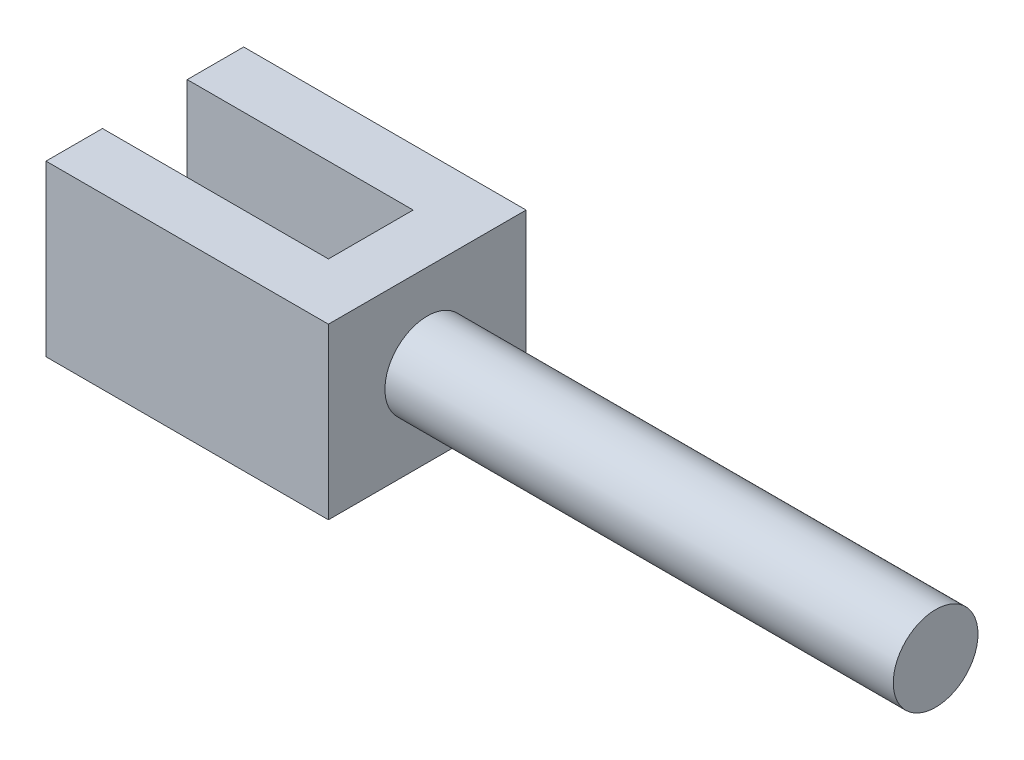
ISO-10303-21;
HEADER;
FILE_DESCRIPTION(('STEP AP214'),'2;1');
FILE_NAME('part.step','',(''),(''),'','','');
FILE_SCHEMA(('AUTOMOTIVE_DESIGN { 1 0 10303 214 1 1 1 1 }'));
ENDSEC;
DATA;
#1=APPLICATION_CONTEXT('core data for automotive mechanical design processes');
#2=APPLICATION_PROTOCOL_DEFINITION('international standard','automotive_design',2000,#1);
#3=PRODUCT_CONTEXT('',#1,'mechanical');
#4=PRODUCT('Part','Part','',(#3));
#5=PRODUCT_RELATED_PRODUCT_CATEGORY('part','',(#4));
#6=PRODUCT_DEFINITION_FORMATION('','',#4);
#7=PRODUCT_DEFINITION_CONTEXT('part definition',#1,'design');
#8=PRODUCT_DEFINITION('design','',#6,#7);
#9=PRODUCT_DEFINITION_SHAPE('','',#8);
#10=(LENGTH_UNIT() NAMED_UNIT(*) SI_UNIT(.MILLI.,.METRE.));
#11=(NAMED_UNIT(*) PLANE_ANGLE_UNIT() SI_UNIT($,.RADIAN.));
#12=(NAMED_UNIT(*) SI_UNIT($,.STERADIAN.) SOLID_ANGLE_UNIT());
#13=UNCERTAINTY_MEASURE_WITH_UNIT(LENGTH_MEASURE(1.E-05),#10,'distance_accuracy_value','');
#14=(GEOMETRIC_REPRESENTATION_CONTEXT(3) GLOBAL_UNCERTAINTY_ASSIGNED_CONTEXT((#13)) GLOBAL_UNIT_ASSIGNED_CONTEXT((#10,
#11,#12)) REPRESENTATION_CONTEXT('',''));
#15=CARTESIAN_POINT('',(0.,0.,0.));
#16=DIRECTION('',(0.,0.,1.));
#17=DIRECTION('',(1.,0.,0.));
#18=AXIS2_PLACEMENT_3D('',#15,#16,#17);
#19=CARTESIAN_POINT('',(10.,0.,0.));
#20=DIRECTION('',(-1.,0.,0.));
#21=DIRECTION('',(0.,0.,1.));
#22=AXIS2_PLACEMENT_3D('',#19,#20,#21);
#23=CYLINDRICAL_SURFACE('',#22,0.75);
#24=CARTESIAN_POINT('',(0.999999999999999,0.,0.));
#25=DIRECTION('',(1.,0.,0.));
#26=DIRECTION('',(0.,0.,-1.));
#27=AXIS2_PLACEMENT_3D('',#24,#25,#26);
#28=CIRCLE('',#27,0.75);
#29=CARTESIAN_POINT('',(0.999999999999999,0.,-0.75));
#30=VERTEX_POINT('',#29);
#31=EDGE_CURVE('E44',#30,#30,#28,.T.);
#32=ORIENTED_EDGE('',*,*,#31,.T.);
#33=EDGE_LOOP('',(#32));
#34=FACE_BOUND('',#33,.T.);
#35=CARTESIAN_POINT('',(10.,0.,0.));
#36=DIRECTION('',(1.,0.,0.));
#37=DIRECTION('',(0.,0.,-1.));
#38=AXIS2_PLACEMENT_3D('',#35,#36,#37);
#39=CIRCLE('',#38,0.75);
#40=CARTESIAN_POINT('',(10.,0.,-0.75));
#41=VERTEX_POINT('',#40);
#42=EDGE_CURVE('E11',#41,#41,#39,.T.);
#43=ORIENTED_EDGE('',*,*,#42,.F.);
#44=EDGE_LOOP('',(#43));
#45=FACE_BOUND('',#44,.T.);
#46=ADVANCED_FACE('F41',(#34,#45),#23,.T.);
#47=CARTESIAN_POINT('',(10.,0.,0.));
#48=DIRECTION('',(1.,0.,0.));
#49=DIRECTION('',(0.,0.,-1.));
#50=AXIS2_PLACEMENT_3D('',#47,#48,#49);
#51=PLANE('',#50);
#52=ORIENTED_EDGE('',*,*,#42,.T.);
#53=EDGE_LOOP('',(#52));
#54=FACE_BOUND('',#53,.T.);
#55=ADVANCED_FACE('F225',(#54),#51,.T.);
#56=CARTESIAN_POINT('',(0.,-1.5,-0.75));
#57=DIRECTION('',(0.,0.,1.));
#58=DIRECTION('',(1.,0.,0.));
#59=AXIS2_PLACEMENT_3D('',#56,#57,#58);
#60=PLANE('',#59);
#61=DIRECTION('',(0.,1.,0.));
#62=VECTOR('',#61,1.);
#63=CARTESIAN_POINT('',(0.,-1.5,-0.75));
#64=LINE('',#63,#62);
#65=CARTESIAN_POINT('',(0.,-1.5,-0.75));
#66=VERTEX_POINT('',#65);
#67=CARTESIAN_POINT('',(0.,1.5,-0.75));
#68=VERTEX_POINT('',#67);
#69=EDGE_CURVE('E105',#66,#68,#64,.T.);
#70=ORIENTED_EDGE('',*,*,#69,.T.);
#71=DIRECTION('',(1.,0.,0.));
#72=VECTOR('',#71,1.);
#73=CARTESIAN_POINT('',(0.,1.5,-0.75));
#74=LINE('',#73,#72);
#75=CARTESIAN_POINT('',(-4.,1.5,-0.75));
#76=VERTEX_POINT('',#75);
#77=EDGE_CURVE('E109',#76,#68,#74,.T.);
#78=ORIENTED_EDGE('',*,*,#77,.F.);
#79=DIRECTION('',(0.,1.,0.));
#80=VECTOR('',#79,1.);
#81=CARTESIAN_POINT('',(-4.,-1.5,-0.75));
#82=LINE('',#81,#80);
#83=CARTESIAN_POINT('',(-4.,-1.5,-0.75));
#84=VERTEX_POINT('',#83);
#85=EDGE_CURVE('E56',#84,#76,#82,.T.);
#86=ORIENTED_EDGE('',*,*,#85,.F.);
#87=DIRECTION('',(1.,0.,0.));
#88=VECTOR('',#87,1.);
#89=CARTESIAN_POINT('',(0.,-1.5,-0.75));
#90=LINE('',#89,#88);
#91=EDGE_CURVE('E110',#84,#66,#90,.T.);
#92=ORIENTED_EDGE('',*,*,#91,.T.);
#93=EDGE_LOOP('',(#70,#78,#86,#92));
#94=FACE_BOUND('',#93,.T.);
#95=ADVANCED_FACE('F107',(#94),#60,.T.);
#96=CARTESIAN_POINT('',(-4.,-1.5,-1.75));
#97=DIRECTION('',(-1.,0.,0.));
#98=DIRECTION('',(0.,0.,1.));
#99=AXIS2_PLACEMENT_3D('',#96,#97,#98);
#100=PLANE('',#99);
#101=ORIENTED_EDGE('',*,*,#85,.T.);
#102=DIRECTION('',(0.,0.,1.));
#103=VECTOR('',#102,1.);
#104=CARTESIAN_POINT('',(-4.,1.5,-1.75));
#105=LINE('',#104,#103);
#106=CARTESIAN_POINT('',(-4.,1.5,-1.75));
#107=VERTEX_POINT('',#106);
#108=EDGE_CURVE('E130',#107,#76,#105,.T.);
#109=ORIENTED_EDGE('',*,*,#108,.F.);
#110=DIRECTION('',(0.,1.,0.));
#111=VECTOR('',#110,1.);
#112=CARTESIAN_POINT('',(-4.,-1.5,-1.75));
#113=LINE('',#112,#111);
#114=CARTESIAN_POINT('',(-4.,-1.5,-1.75));
#115=VERTEX_POINT('',#114);
#116=EDGE_CURVE('E64',#115,#107,#113,.T.);
#117=ORIENTED_EDGE('',*,*,#116,.F.);
#118=DIRECTION('',(0.,0.,1.));
#119=VECTOR('',#118,1.);
#120=CARTESIAN_POINT('',(-4.,-1.5,-1.75));
#121=LINE('',#120,#119);
#122=EDGE_CURVE('E116',#115,#84,#121,.T.);
#123=ORIENTED_EDGE('',*,*,#122,.T.);
#124=EDGE_LOOP('',(#101,#109,#117,#123));
#125=FACE_BOUND('',#124,.T.);
#126=ADVANCED_FACE('F217',(#125),#100,.T.);
#127=CARTESIAN_POINT('',(1.,-1.5,-1.75));
#128=DIRECTION('',(0.,0.,-1.));
#129=DIRECTION('',(-1.,0.,0.));
#130=AXIS2_PLACEMENT_3D('',#127,#128,#129);
#131=PLANE('',#130);
#132=ORIENTED_EDGE('',*,*,#116,.T.);
#133=DIRECTION('',(-1.,0.,0.));
#134=VECTOR('',#133,1.);
#135=CARTESIAN_POINT('',(1.,1.5,-1.75));
#136=LINE('',#135,#134);
#137=CARTESIAN_POINT('',(1.,1.5,-1.75));
#138=VERTEX_POINT('',#137);
#139=EDGE_CURVE('E148',#138,#107,#136,.T.);
#140=ORIENTED_EDGE('',*,*,#139,.F.);
#141=DIRECTION('',(0.,1.,0.));
#142=VECTOR('',#141,1.);
#143=CARTESIAN_POINT('',(1.,-1.5,-1.75));
#144=LINE('',#143,#142);
#145=CARTESIAN_POINT('',(1.,-1.5,-1.75));
#146=VERTEX_POINT('',#145);
#147=EDGE_CURVE('E183',#146,#138,#144,.T.);
#148=ORIENTED_EDGE('',*,*,#147,.F.);
#149=DIRECTION('',(-1.,0.,0.));
#150=VECTOR('',#149,1.);
#151=CARTESIAN_POINT('',(1.,-1.5,-1.75));
#152=LINE('',#151,#150);
#153=EDGE_CURVE('E174',#146,#115,#152,.T.);
#154=ORIENTED_EDGE('',*,*,#153,.T.);
#155=EDGE_LOOP('',(#132,#140,#148,#154));
#156=FACE_BOUND('',#155,.T.);
#157=ADVANCED_FACE('F206',(#156),#131,.T.);
#158=CARTESIAN_POINT('',(1.,-1.5,-1.75));
#159=DIRECTION('',(1.,0.,0.));
#160=DIRECTION('',(0.,0.,-1.));
#161=AXIS2_PLACEMENT_3D('',#158,#159,#160);
#162=PLANE('',#161);
#163=ORIENTED_EDGE('',*,*,#31,.F.);
#164=EDGE_LOOP('',(#163));
#165=FACE_BOUND('',#164,.T.);
#166=ORIENTED_EDGE('',*,*,#147,.T.);
#167=DIRECTION('',(0.,0.,-1.));
#168=VECTOR('',#167,1.);
#169=CARTESIAN_POINT('',(1.,1.5,-1.75));
#170=LINE('',#169,#168);
#171=CARTESIAN_POINT('',(1.,1.5,1.75));
#172=VERTEX_POINT('',#171);
#173=EDGE_CURVE('E144',#172,#138,#170,.T.);
#174=ORIENTED_EDGE('',*,*,#173,.F.);
#175=DIRECTION('',(0.,1.,0.));
#176=VECTOR('',#175,1.);
#177=CARTESIAN_POINT('',(1.,-1.5,1.75));
#178=LINE('',#177,#176);
#179=CARTESIAN_POINT('',(1.,-1.5,1.75));
#180=VERTEX_POINT('',#179);
#181=EDGE_CURVE('E186',#180,#172,#178,.T.);
#182=ORIENTED_EDGE('',*,*,#181,.F.);
#183=DIRECTION('',(0.,0.,-1.));
#184=VECTOR('',#183,1.);
#185=CARTESIAN_POINT('',(1.,-1.5,-1.75));
#186=LINE('',#185,#184);
#187=EDGE_CURVE('E170',#180,#146,#186,.T.);
#188=ORIENTED_EDGE('',*,*,#187,.T.);
#189=EDGE_LOOP('',(#166,#174,#182,#188));
#190=FACE_BOUND('',#189,.T.);
#191=ADVANCED_FACE('F202',(#165,#190),#162,.T.);
#192=CARTESIAN_POINT('',(1.,-1.5,1.75));
#193=DIRECTION('',(0.,0.,1.));
#194=DIRECTION('',(1.,0.,0.));
#195=AXIS2_PLACEMENT_3D('',#192,#193,#194);
#196=PLANE('',#195);
#197=ORIENTED_EDGE('',*,*,#181,.T.);
#198=DIRECTION('',(1.,0.,0.));
#199=VECTOR('',#198,1.);
#200=CARTESIAN_POINT('',(1.,1.5,1.75));
#201=LINE('',#200,#199);
#202=CARTESIAN_POINT('',(-4.,1.5,1.75));
#203=VERTEX_POINT('',#202);
#204=EDGE_CURVE('E140',#203,#172,#201,.T.);
#205=ORIENTED_EDGE('',*,*,#204,.F.);
#206=DIRECTION('',(0.,1.,0.));
#207=VECTOR('',#206,1.);
#208=CARTESIAN_POINT('',(-4.,-1.5,1.75));
#209=LINE('',#208,#207);
#210=CARTESIAN_POINT('',(-4.,-1.5,1.75));
#211=VERTEX_POINT('',#210);
#212=EDGE_CURVE('E189',#211,#203,#209,.T.);
#213=ORIENTED_EDGE('',*,*,#212,.F.);
#214=DIRECTION('',(1.,0.,0.));
#215=VECTOR('',#214,1.);
#216=CARTESIAN_POINT('',(1.,-1.5,1.75));
#217=LINE('',#216,#215);
#218=EDGE_CURVE('E166',#211,#180,#217,.T.);
#219=ORIENTED_EDGE('',*,*,#218,.T.);
#220=EDGE_LOOP('',(#197,#205,#213,#219));
#221=FACE_BOUND('',#220,.T.);
#222=ADVANCED_FACE('F205',(#221),#196,.T.);
#223=CARTESIAN_POINT('',(-4.,-1.5,0.750000000000001));
#224=DIRECTION('',(-1.,0.,0.));
#225=DIRECTION('',(0.,0.,1.));
#226=AXIS2_PLACEMENT_3D('',#223,#224,#225);
#227=PLANE('',#226);
#228=ORIENTED_EDGE('',*,*,#212,.T.);
#229=DIRECTION('',(0.,0.,1.));
#230=VECTOR('',#229,1.);
#231=CARTESIAN_POINT('',(-4.,1.5,0.750000000000001));
#232=LINE('',#231,#230);
#233=CARTESIAN_POINT('',(-4.,1.5,0.750000000000001));
#234=VERTEX_POINT('',#233);
#235=EDGE_CURVE('E136',#234,#203,#232,.T.);
#236=ORIENTED_EDGE('',*,*,#235,.F.);
#237=DIRECTION('',(0.,1.,0.));
#238=VECTOR('',#237,1.);
#239=CARTESIAN_POINT('',(-4.,-1.5,0.750000000000001));
#240=LINE('',#239,#238);
#241=CARTESIAN_POINT('',(-4.,-1.5,0.750000000000001));
#242=VERTEX_POINT('',#241);
#243=EDGE_CURVE('E192',#242,#234,#240,.T.);
#244=ORIENTED_EDGE('',*,*,#243,.F.);
#245=DIRECTION('',(0.,0.,1.));
#246=VECTOR('',#245,1.);
#247=CARTESIAN_POINT('',(-4.,-1.5,0.750000000000001));
#248=LINE('',#247,#246);
#249=EDGE_CURVE('E162',#242,#211,#248,.T.);
#250=ORIENTED_EDGE('',*,*,#249,.T.);
#251=EDGE_LOOP('',(#228,#236,#244,#250));
#252=FACE_BOUND('',#251,.T.);
#253=ADVANCED_FACE('F249',(#252),#227,.T.);
#254=CARTESIAN_POINT('',(-4.,-1.5,0.750000000000001));
#255=DIRECTION('',(0.,0.,-1.));
#256=DIRECTION('',(-1.,0.,0.));
#257=AXIS2_PLACEMENT_3D('',#254,#255,#256);
#258=PLANE('',#257);
#259=ORIENTED_EDGE('',*,*,#243,.T.);
#260=DIRECTION('',(-1.,0.,0.));
#261=VECTOR('',#260,1.);
#262=CARTESIAN_POINT('',(-4.,1.5,0.750000000000001));
#263=LINE('',#262,#261);
#264=CARTESIAN_POINT('',(0.,1.5,0.75));
#265=VERTEX_POINT('',#264);
#266=EDGE_CURVE('E125',#265,#234,#263,.T.);
#267=ORIENTED_EDGE('',*,*,#266,.F.);
#268=DIRECTION('',(0.,1.,0.));
#269=VECTOR('',#268,1.);
#270=CARTESIAN_POINT('',(0.,-1.5,0.75));
#271=LINE('',#270,#269);
#272=CARTESIAN_POINT('',(0.,-1.5,0.75));
#273=VERTEX_POINT('',#272);
#274=EDGE_CURVE('E115',#273,#265,#271,.T.);
#275=ORIENTED_EDGE('',*,*,#274,.F.);
#276=DIRECTION('',(-1.,0.,0.));
#277=VECTOR('',#276,1.);
#278=CARTESIAN_POINT('',(-4.,-1.5,0.750000000000001));
#279=LINE('',#278,#277);
#280=EDGE_CURVE('E158',#273,#242,#279,.T.);
#281=ORIENTED_EDGE('',*,*,#280,.T.);
#282=EDGE_LOOP('',(#259,#267,#275,#281));
#283=FACE_BOUND('',#282,.T.);
#284=ADVANCED_FACE('F245',(#283),#258,.T.);
#285=CARTESIAN_POINT('',(0.,-1.5,0.));
#286=DIRECTION('',(0.,1.,0.));
#287=DIRECTION('',(0.,0.,1.));
#288=AXIS2_PLACEMENT_3D('',#285,#286,#287);
#289=PLANE('',#288);
#290=ORIENTED_EDGE('',*,*,#91,.F.);
#291=ORIENTED_EDGE('',*,*,#122,.F.);
#292=ORIENTED_EDGE('',*,*,#153,.F.);
#293=ORIENTED_EDGE('',*,*,#187,.F.);
#294=ORIENTED_EDGE('',*,*,#218,.F.);
#295=ORIENTED_EDGE('',*,*,#249,.F.);
#296=ORIENTED_EDGE('',*,*,#280,.F.);
#297=DIRECTION('',(0.,0.,1.));
#298=VECTOR('',#297,1.);
#299=CARTESIAN_POINT('',(0.,-1.5,-0.75));
#300=LINE('',#299,#298);
#301=EDGE_CURVE('E155',#66,#273,#300,.T.);
#302=ORIENTED_EDGE('',*,*,#301,.F.);
#303=EDGE_LOOP('',(#290,#291,#292,#293,#294,#295,#296,#302));
#304=FACE_BOUND('',#303,.T.);
#305=ADVANCED_FACE('F216',(#304),#289,.F.);
#306=CARTESIAN_POINT('',(0.,1.5,0.));
#307=DIRECTION('',(0.,1.,0.));
#308=DIRECTION('',(0.,0.,1.));
#309=AXIS2_PLACEMENT_3D('',#306,#307,#308);
#310=PLANE('',#309);
#311=ORIENTED_EDGE('',*,*,#77,.T.);
#312=DIRECTION('',(0.,0.,1.));
#313=VECTOR('',#312,1.);
#314=CARTESIAN_POINT('',(0.,1.5,-0.75));
#315=LINE('',#314,#313);
#316=EDGE_CURVE('E119',#68,#265,#315,.T.);
#317=ORIENTED_EDGE('',*,*,#316,.T.);
#318=ORIENTED_EDGE('',*,*,#266,.T.);
#319=ORIENTED_EDGE('',*,*,#235,.T.);
#320=ORIENTED_EDGE('',*,*,#204,.T.);
#321=ORIENTED_EDGE('',*,*,#173,.T.);
#322=ORIENTED_EDGE('',*,*,#139,.T.);
#323=ORIENTED_EDGE('',*,*,#108,.T.);
#324=EDGE_LOOP('',(#311,#317,#318,#319,#320,#321,#322,#323));
#325=FACE_BOUND('',#324,.T.);
#326=ADVANCED_FACE('F128',(#325),#310,.T.);
#327=CARTESIAN_POINT('',(0.,0.,0.));
#328=DIRECTION('',(1.,0.,0.));
#329=DIRECTION('',(0.,0.,-1.));
#330=AXIS2_PLACEMENT_3D('',#327,#328,#329);
#331=PLANE('',#330);
#332=ORIENTED_EDGE('',*,*,#301,.T.);
#333=ORIENTED_EDGE('',*,*,#274,.T.);
#334=ORIENTED_EDGE('',*,*,#316,.F.);
#335=ORIENTED_EDGE('',*,*,#69,.F.);
#336=EDGE_LOOP('',(#332,#333,#334,#335));
#337=FACE_BOUND('',#336,.T.);
#338=ADVANCED_FACE('F120',(#337),#331,.F.);
#339=CLOSED_SHELL('',(#46,#55,#95,#126,#157,#191,#222,#253,#284,#305,#326,#338));
#340=MANIFOLD_SOLID_BREP('B2',#339);
#341=ADVANCED_BREP_SHAPE_REPRESENTATION('',(#18,#340),#14);
#342=SHAPE_DEFINITION_REPRESENTATION(#9,#341);
ENDSEC;
END-ISO-10303-21;
